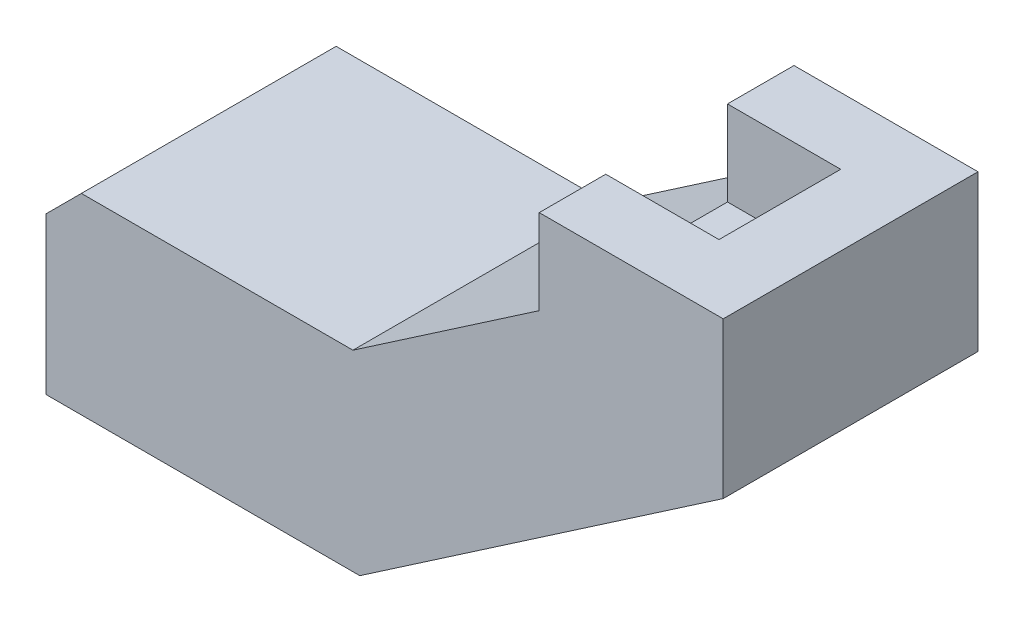
ISO-10303-21;
HEADER;
FILE_DESCRIPTION(('STEP AP214'),'2;1');
FILE_NAME('part.step','',(''),(''),'','','');
FILE_SCHEMA(('AUTOMOTIVE_DESIGN { 1 0 10303 214 1 1 1 1 }'));
ENDSEC;
DATA;
#1=APPLICATION_CONTEXT('core data for automotive mechanical design processes');
#2=APPLICATION_PROTOCOL_DEFINITION('international standard','automotive_design',2000,#1);
#3=PRODUCT_CONTEXT('',#1,'mechanical');
#4=PRODUCT('Part','Part','',(#3));
#5=PRODUCT_RELATED_PRODUCT_CATEGORY('part','',(#4));
#6=PRODUCT_DEFINITION_FORMATION('','',#4);
#7=PRODUCT_DEFINITION_CONTEXT('part definition',#1,'design');
#8=PRODUCT_DEFINITION('design','',#6,#7);
#9=PRODUCT_DEFINITION_SHAPE('','',#8);
#10=(LENGTH_UNIT() NAMED_UNIT(*) SI_UNIT(.MILLI.,.METRE.));
#11=(NAMED_UNIT(*) PLANE_ANGLE_UNIT() SI_UNIT($,.RADIAN.));
#12=(NAMED_UNIT(*) SI_UNIT($,.STERADIAN.) SOLID_ANGLE_UNIT());
#13=UNCERTAINTY_MEASURE_WITH_UNIT(LENGTH_MEASURE(1.E-05),#10,'distance_accuracy_value','');
#14=(GEOMETRIC_REPRESENTATION_CONTEXT(3) GLOBAL_UNCERTAINTY_ASSIGNED_CONTEXT((#13)) GLOBAL_UNIT_ASSIGNED_CONTEXT((#10,
#11,#12)) REPRESENTATION_CONTEXT('',''));
#15=CARTESIAN_POINT('',(0.,0.,0.));
#16=DIRECTION('',(0.,0.,1.));
#17=DIRECTION('',(1.,0.,0.));
#18=AXIS2_PLACEMENT_3D('',#15,#16,#17);
#19=CARTESIAN_POINT('',(-20.6795033401632,-22.556349186104,5.));
#20=DIRECTION('',(0.,1.,0.));
#21=DIRECTION('',(0.,0.,1.));
#22=AXIS2_PLACEMENT_3D('',#19,#20,#21);
#23=PLANE('',#22);
#24=DIRECTION('',(0.,0.,1.));
#25=VECTOR('',#24,1.);
#26=CARTESIAN_POINT('',(-42.85,-22.556349186104,-13.));
#27=LINE('',#26,#25);
#28=CARTESIAN_POINT('',(-42.85,-22.556349186104,-13.));
#29=VERTEX_POINT('',#28);
#30=CARTESIAN_POINT('',(-42.85,-22.556349186104,5.));
#31=VERTEX_POINT('',#30);
#32=EDGE_CURVE('E173',#29,#31,#27,.T.);
#33=ORIENTED_EDGE('',*,*,#32,.F.);
#34=DIRECTION('',(1.,0.,0.));
#35=VECTOR('',#34,1.);
#36=CARTESIAN_POINT('',(-20.6795033401632,-22.556349186104,-13.));
#37=LINE('',#36,#35);
#38=CARTESIAN_POINT('',(-20.6795033401632,-22.556349186104,-13.));
#39=VERTEX_POINT('',#38);
#40=EDGE_CURVE('E182',#29,#39,#37,.T.);
#41=ORIENTED_EDGE('',*,*,#40,.T.);
#42=DIRECTION('',(0.,0.,-1.));
#43=VECTOR('',#42,1.);
#44=CARTESIAN_POINT('',(-20.6795033401632,-22.556349186104,5.));
#45=LINE('',#44,#43);
#46=CARTESIAN_POINT('',(-20.6795033401632,-22.556349186104,5.));
#47=VERTEX_POINT('',#46);
#48=EDGE_CURVE('E222',#47,#39,#45,.T.);
#49=ORIENTED_EDGE('',*,*,#48,.F.);
#50=DIRECTION('',(1.,0.,0.));
#51=VECTOR('',#50,1.);
#52=CARTESIAN_POINT('',(-20.6795033401632,-22.556349186104,5.));
#53=LINE('',#52,#51);
#54=EDGE_CURVE('E184',#31,#47,#53,.T.);
#55=ORIENTED_EDGE('',*,*,#54,.F.);
#56=EDGE_LOOP('',(#33,#41,#49,#55));
#57=FACE_BOUND('',#56,.T.);
#58=ADVANCED_FACE('F42',(#57),#23,.F.);
#59=CARTESIAN_POINT('',(0.,0.,5.));
#60=DIRECTION('',(0.,0.,-1.));
#61=DIRECTION('',(-1.,0.,0.));
#62=AXIS2_PLACEMENT_3D('',#59,#60,#61);
#63=PLANE('',#62);
#64=DIRECTION('',(-1.,0.,0.));
#65=VECTOR('',#64,1.);
#66=CARTESIAN_POINT('',(-34.3284271247462,-8.99999999999999,5.));
#67=LINE('',#66,#65);
#68=CARTESIAN_POINT('',(-21.1642135623731,-8.99999999999999,5.));
#69=VERTEX_POINT('',#68);
#70=CARTESIAN_POINT('',(-40.35,-8.99999999999999,5.));
#71=VERTEX_POINT('',#70);
#72=EDGE_CURVE('E207',#69,#71,#67,.T.);
#73=ORIENTED_EDGE('',*,*,#72,.T.);
#74=DIRECTION('',(-0.707106781186547,-0.707106781186549,0.));
#75=VECTOR('',#74,1.);
#76=CARTESIAN_POINT('',(-40.35,-8.99999999999999,5.));
#77=LINE('',#76,#75);
#78=CARTESIAN_POINT('',(-42.85,-11.5,5.));
#79=VERTEX_POINT('',#78);
#80=EDGE_CURVE('E65',#71,#79,#77,.T.);
#81=ORIENTED_EDGE('',*,*,#80,.T.);
#82=DIRECTION('',(0.,-1.,0.));
#83=VECTOR('',#82,1.);
#84=CARTESIAN_POINT('',(-42.85,0.,5.));
#85=LINE('',#84,#83);
#86=EDGE_CURVE('E178',#79,#31,#85,.T.);
#87=ORIENTED_EDGE('',*,*,#86,.T.);
#88=ORIENTED_EDGE('',*,*,#54,.T.);
#89=DIRECTION('',(0.82551451114158,0.56438089256696,0.));
#90=VECTOR('',#89,1.);
#91=CARTESIAN_POINT('',(5.,-5.,5.));
#92=LINE('',#91,#90);
#93=CARTESIAN_POINT('',(5.,-5.,5.));
#94=VERTEX_POINT('',#93);
#95=EDGE_CURVE('E210',#47,#94,#92,.T.);
#96=ORIENTED_EDGE('',*,*,#95,.T.);
#97=DIRECTION('',(0.,1.,0.));
#98=VECTOR('',#97,1.);
#99=CARTESIAN_POINT('',(5.,6.,5.));
#100=LINE('',#99,#98);
#101=CARTESIAN_POINT('',(5.,6.,5.));
#102=VERTEX_POINT('',#101);
#103=EDGE_CURVE('E212',#94,#102,#100,.T.);
#104=ORIENTED_EDGE('',*,*,#103,.T.);
#105=DIRECTION('',(-1.,0.,0.));
#106=VECTOR('',#105,1.);
#107=CARTESIAN_POINT('',(0.,6.,5.));
#108=LINE('',#107,#106);
#109=CARTESIAN_POINT('',(-8.,6.,5.));
#110=VERTEX_POINT('',#109);
#111=EDGE_CURVE('E214',#102,#110,#108,.T.);
#112=ORIENTED_EDGE('',*,*,#111,.T.);
#113=DIRECTION('',(0.,-1.,0.));
#114=VECTOR('',#113,1.);
#115=CARTESIAN_POINT('',(-8.,15.2784697014109,5.));
#116=LINE('',#115,#114);
#117=CARTESIAN_POINT('',(-8.,0.,5.));
#118=VERTEX_POINT('',#117);
#119=EDGE_CURVE('E273',#110,#118,#116,.T.);
#120=ORIENTED_EDGE('',*,*,#119,.T.);
#121=DIRECTION('',(-0.82551451114158,-0.56438089256696,0.));
#122=VECTOR('',#121,1.);
#123=CARTESIAN_POINT('',(-8.,0.,5.));
#124=LINE('',#123,#122);
#125=EDGE_CURVE('E205',#118,#69,#124,.T.);
#126=ORIENTED_EDGE('',*,*,#125,.T.);
#127=EDGE_LOOP('',(#73,#81,#87,#88,#96,#104,#112,#120,#126));
#128=FACE_BOUND('',#127,.T.);
#129=ADVANCED_FACE('F269',(#128),#63,.F.);
#130=CARTESIAN_POINT('',(0.,0.,-13.));
#131=DIRECTION('',(0.,0.,-1.));
#132=DIRECTION('',(-1.,0.,0.));
#133=AXIS2_PLACEMENT_3D('',#130,#131,#132);
#134=PLANE('',#133);
#135=DIRECTION('',(0.,-1.,0.));
#136=VECTOR('',#135,1.);
#137=CARTESIAN_POINT('',(-42.85,0.,-13.));
#138=LINE('',#137,#136);
#139=CARTESIAN_POINT('',(-42.85,-11.5,-13.));
#140=VERTEX_POINT('',#139);
#141=EDGE_CURVE('E170',#140,#29,#138,.T.);
#142=ORIENTED_EDGE('',*,*,#141,.F.);
#143=DIRECTION('',(0.707106781186547,0.707106781186549,0.));
#144=VECTOR('',#143,1.);
#145=CARTESIAN_POINT('',(-15.6750000000001,15.675,-13.));
#146=LINE('',#145,#144);
#147=CARTESIAN_POINT('',(-40.35,-8.99999999999999,-13.));
#148=VERTEX_POINT('',#147);
#149=EDGE_CURVE('E11',#140,#148,#146,.T.);
#150=ORIENTED_EDGE('',*,*,#149,.T.);
#151=DIRECTION('',(-1.,0.,0.));
#152=VECTOR('',#151,1.);
#153=CARTESIAN_POINT('',(-34.3284271247462,-8.99999999999999,-13.));
#154=LINE('',#153,#152);
#155=CARTESIAN_POINT('',(-21.1642135623731,-8.99999999999999,-13.));
#156=VERTEX_POINT('',#155);
#157=EDGE_CURVE('E192',#156,#148,#154,.T.);
#158=ORIENTED_EDGE('',*,*,#157,.F.);
#159=DIRECTION('',(-0.82551451114158,-0.56438089256696,0.));
#160=VECTOR('',#159,1.);
#161=CARTESIAN_POINT('',(-8.,0.,-13.));
#162=LINE('',#161,#160);
#163=CARTESIAN_POINT('',(-8.,0.,-13.));
#164=VERTEX_POINT('',#163);
#165=EDGE_CURVE('E197',#164,#156,#162,.T.);
#166=ORIENTED_EDGE('',*,*,#165,.F.);
#167=DIRECTION('',(0.,-1.,0.));
#168=VECTOR('',#167,1.);
#169=CARTESIAN_POINT('',(-8.,15.2784697014109,-13.));
#170=LINE('',#169,#168);
#171=CARTESIAN_POINT('',(-8.,6.,-13.));
#172=VERTEX_POINT('',#171);
#173=EDGE_CURVE('E325',#172,#164,#170,.T.);
#174=ORIENTED_EDGE('',*,*,#173,.F.);
#175=DIRECTION('',(-1.,0.,0.));
#176=VECTOR('',#175,1.);
#177=CARTESIAN_POINT('',(0.,6.,-13.));
#178=LINE('',#177,#176);
#179=CARTESIAN_POINT('',(5.,6.,-13.));
#180=VERTEX_POINT('',#179);
#181=EDGE_CURVE('E203',#180,#172,#178,.T.);
#182=ORIENTED_EDGE('',*,*,#181,.F.);
#183=DIRECTION('',(0.,1.,0.));
#184=VECTOR('',#183,1.);
#185=CARTESIAN_POINT('',(5.,6.,-13.));
#186=LINE('',#185,#184);
#187=CARTESIAN_POINT('',(5.,-5.,-13.));
#188=VERTEX_POINT('',#187);
#189=EDGE_CURVE('E194',#188,#180,#186,.T.);
#190=ORIENTED_EDGE('',*,*,#189,.F.);
#191=DIRECTION('',(0.82551451114158,0.56438089256696,0.));
#192=VECTOR('',#191,1.);
#193=CARTESIAN_POINT('',(5.,-5.,-13.));
#194=LINE('',#193,#192);
#195=EDGE_CURVE('E191',#39,#188,#194,.T.);
#196=ORIENTED_EDGE('',*,*,#195,.F.);
#197=ORIENTED_EDGE('',*,*,#40,.F.);
#198=EDGE_LOOP('',(#142,#150,#158,#166,#174,#182,#190,#196,#197));
#199=FACE_BOUND('',#198,.T.);
#200=ADVANCED_FACE('F188',(#199),#134,.T.);
#201=CARTESIAN_POINT('',(-3.,-22.556349186104,-3.95));
#202=DIRECTION('',(0.,1.,0.));
#203=DIRECTION('',(0.,0.,1.));
#204=AXIS2_PLACEMENT_3D('',#201,#202,#203);
#205=CYLINDRICAL_SURFACE('',#204,1.5);
#206=CARTESIAN_POINT('',(-3.,0.,-3.95));
#207=DIRECTION('',(0.,1.,0.));
#208=DIRECTION('',(0.,0.,1.));
#209=AXIS2_PLACEMENT_3D('',#206,#207,#208);
#210=CIRCLE('',#209,1.5);
#211=CARTESIAN_POINT('',(-3.,0.,-2.45));
#212=VERTEX_POINT('',#211);
#213=EDGE_CURVE('E348',#212,#212,#210,.T.);
#214=ORIENTED_EDGE('',*,*,#213,.T.);
#215=EDGE_LOOP('',(#214));
#216=FACE_BOUND('',#215,.T.);
#217=CARTESIAN_POINT('',(-3.,-5.,-3.95));
#218=DIRECTION('',(0.,-1.,0.));
#219=DIRECTION('',(0.,0.,-1.));
#220=AXIS2_PLACEMENT_3D('',#217,#218,#219);
#221=CIRCLE('',#220,1.5);
#222=CARTESIAN_POINT('',(-3.,-5.,-5.45));
#223=VERTEX_POINT('',#222);
#224=EDGE_CURVE('E234',#223,#223,#221,.F.);
#225=ORIENTED_EDGE('',*,*,#224,.F.);
#226=EDGE_LOOP('',(#225));
#227=FACE_BOUND('',#226,.T.);
#228=ADVANCED_FACE('F308',(#216,#227),#205,.F.);
#229=CARTESIAN_POINT('',(0.,0.,5.));
#230=DIRECTION('',(1.,0.,0.));
#231=DIRECTION('',(0.,0.,-1.));
#232=AXIS2_PLACEMENT_3D('',#229,#230,#231);
#233=PLANE('',#232);
#234=DIRECTION('',(0.,-1.,0.));
#235=VECTOR('',#234,1.);
#236=CARTESIAN_POINT('',(0.,15.2784697014109,-8.3));
#237=LINE('',#236,#235);
#238=CARTESIAN_POINT('',(0.,6.,-8.3));
#239=VERTEX_POINT('',#238);
#240=CARTESIAN_POINT('',(0.,0.,-8.3));
#241=VERTEX_POINT('',#240);
#242=EDGE_CURVE('E317',#239,#241,#237,.T.);
#243=ORIENTED_EDGE('',*,*,#242,.T.);
#244=DIRECTION('',(0.,0.,-1.));
#245=VECTOR('',#244,1.);
#246=CARTESIAN_POINT('',(0.,0.,5.));
#247=LINE('',#246,#245);
#248=CARTESIAN_POINT('',(0.,0.,0.3));
#249=VERTEX_POINT('',#248);
#250=EDGE_CURVE('E230',#249,#241,#247,.T.);
#251=ORIENTED_EDGE('',*,*,#250,.F.);
#252=DIRECTION('',(0.,-1.,0.));
#253=VECTOR('',#252,1.);
#254=CARTESIAN_POINT('',(0.,15.2784697014109,0.3));
#255=LINE('',#254,#253);
#256=CARTESIAN_POINT('',(0.,6.,0.3));
#257=VERTEX_POINT('',#256);
#258=EDGE_CURVE('E354',#257,#249,#255,.T.);
#259=ORIENTED_EDGE('',*,*,#258,.F.);
#260=DIRECTION('',(0.,0.,-1.));
#261=VECTOR('',#260,1.);
#262=CARTESIAN_POINT('',(0.,6.,5.));
#263=LINE('',#262,#261);
#264=EDGE_CURVE('E216',#257,#239,#263,.T.);
#265=ORIENTED_EDGE('',*,*,#264,.T.);
#266=EDGE_LOOP('',(#243,#251,#259,#265));
#267=FACE_BOUND('',#266,.T.);
#268=ADVANCED_FACE('F305',(#267),#233,.F.);
#269=CARTESIAN_POINT('',(-8.,0.,5.));
#270=DIRECTION('',(0.,-1.,0.));
#271=DIRECTION('',(0.,0.,-1.));
#272=AXIS2_PLACEMENT_3D('',#269,#270,#271);
#273=PLANE('',#272);
#274=ORIENTED_EDGE('',*,*,#213,.F.);
#275=EDGE_LOOP('',(#274));
#276=FACE_BOUND('',#275,.T.);
#277=DIRECTION('',(1.,0.,0.));
#278=VECTOR('',#277,1.);
#279=CARTESIAN_POINT('',(-8.,0.,-8.3));
#280=LINE('',#279,#278);
#281=CARTESIAN_POINT('',(-8.,0.,-8.3));
#282=VERTEX_POINT('',#281);
#283=EDGE_CURVE('E330',#282,#241,#280,.T.);
#284=ORIENTED_EDGE('',*,*,#283,.F.);
#285=DIRECTION('',(0.,0.,-1.));
#286=VECTOR('',#285,1.);
#287=CARTESIAN_POINT('',(-8.,0.,5.));
#288=LINE('',#287,#286);
#289=CARTESIAN_POINT('',(-8.,0.,0.3));
#290=VERTEX_POINT('',#289);
#291=EDGE_CURVE('E226',#290,#282,#288,.T.);
#292=ORIENTED_EDGE('',*,*,#291,.F.);
#293=DIRECTION('',(-1.,0.,0.));
#294=VECTOR('',#293,1.);
#295=CARTESIAN_POINT('',(-8.,0.,0.3));
#296=LINE('',#295,#294);
#297=EDGE_CURVE('E333',#249,#290,#296,.T.);
#298=ORIENTED_EDGE('',*,*,#297,.F.);
#299=ORIENTED_EDGE('',*,*,#250,.T.);
#300=EDGE_LOOP('',(#284,#292,#298,#299));
#301=FACE_BOUND('',#300,.T.);
#302=ADVANCED_FACE('F303',(#276,#301),#273,.F.);
#303=CARTESIAN_POINT('',(-8.,0.,5.));
#304=DIRECTION('',(0.56438089256696,-0.82551451114158,0.));
#305=DIRECTION('',(0.82551451114158,0.56438089256696,0.));
#306=AXIS2_PLACEMENT_3D('',#303,#304,#305);
#307=PLANE('',#306);
#308=EDGE_CURVE('E227',#118,#290,#288,.T.);
#309=ORIENTED_EDGE('',*,*,#308,.T.);
#310=ORIENTED_EDGE('',*,*,#291,.T.);
#311=DIRECTION('',(0.,0.,1.));
#312=VECTOR('',#311,1.);
#313=CARTESIAN_POINT('',(-8.,0.,-13.));
#314=LINE('',#313,#312);
#315=EDGE_CURVE('E237',#164,#282,#314,.T.);
#316=ORIENTED_EDGE('',*,*,#315,.F.);
#317=ORIENTED_EDGE('',*,*,#165,.T.);
#318=DIRECTION('',(0.,0.,-1.));
#319=VECTOR('',#318,1.);
#320=CARTESIAN_POINT('',(-21.1642135623731,-8.99999999999999,5.));
#321=LINE('',#320,#319);
#322=EDGE_CURVE('E224',#69,#156,#321,.T.);
#323=ORIENTED_EDGE('',*,*,#322,.F.);
#324=ORIENTED_EDGE('',*,*,#125,.F.);
#325=EDGE_LOOP('',(#309,#310,#316,#317,#323,#324));
#326=FACE_BOUND('',#325,.T.);
#327=ADVANCED_FACE('F277',(#326),#307,.F.);
#328=CARTESIAN_POINT('',(-34.3284271247462,-8.99999999999999,5.));
#329=DIRECTION('',(0.,-1.,0.));
#330=DIRECTION('',(0.,0.,-1.));
#331=AXIS2_PLACEMENT_3D('',#328,#329,#330);
#332=PLANE('',#331);
#333=ORIENTED_EDGE('',*,*,#157,.T.);
#334=DIRECTION('',(0.,0.,1.));
#335=VECTOR('',#334,1.);
#336=CARTESIAN_POINT('',(-40.35,-8.99999999999999,5.));
#337=LINE('',#336,#335);
#338=EDGE_CURVE('E256',#148,#71,#337,.T.);
#339=ORIENTED_EDGE('',*,*,#338,.T.);
#340=ORIENTED_EDGE('',*,*,#72,.F.);
#341=ORIENTED_EDGE('',*,*,#322,.T.);
#342=EDGE_LOOP('',(#333,#339,#340,#341));
#343=FACE_BOUND('',#342,.T.);
#344=ADVANCED_FACE('F266',(#343),#332,.F.);
#345=CARTESIAN_POINT('',(5.,-5.,5.));
#346=DIRECTION('',(-0.56438089256696,0.825514511141579,0.));
#347=DIRECTION('',(-0.82551451114158,-0.56438089256696,0.));
#348=AXIS2_PLACEMENT_3D('',#345,#346,#347);
#349=PLANE('',#348);
#350=DIRECTION('',(0.82551451114158,0.56438089256696,0.));
#351=VECTOR('',#350,1.);
#352=CARTESIAN_POINT('',(5.,-5.,-0.95));
#353=LINE('',#352,#351);
#354=CARTESIAN_POINT('',(-4.73205080756888,-11.6535275239283,-0.949999999999999));
#355=VERTEX_POINT('',#354);
#356=CARTESIAN_POINT('',(-1.26794919243112,-9.28521935356014,-0.95));
#357=VERTEX_POINT('',#356);
#358=EDGE_CURVE('E250',#355,#357,#353,.T.);
#359=ORIENTED_EDGE('',*,*,#358,.T.);
#360=DIRECTION('',(0.473121017820373,0.323459441022298,-0.819469640993586));
#361=VECTOR('',#360,1.);
#362=CARTESIAN_POINT('',(-1.51598345640961,-9.45479335547294,-0.520392052771308));
#363=LINE('',#362,#361);
#364=CARTESIAN_POINT('',(0.464101615137756,-8.10106526837605,-3.95));
#365=VERTEX_POINT('',#364);
#366=EDGE_CURVE('E253',#357,#365,#363,.T.);
#367=ORIENTED_EDGE('',*,*,#366,.T.);
#368=DIRECTION('',(-0.473121017820373,-0.323459441022298,-0.819469640993586));
#369=VECTOR('',#368,1.);
#370=CARTESIAN_POINT('',(5.42399530368447,-4.71012641848448,4.64078786870312));
#371=LINE('',#370,#369);
#372=CARTESIAN_POINT('',(-1.26794919243112,-9.28521935356014,-6.95));
#373=VERTEX_POINT('',#372);
#374=EDGE_CURVE('E233',#365,#373,#371,.T.);
#375=ORIENTED_EDGE('',*,*,#374,.T.);
#376=DIRECTION('',(-0.82551451114158,-0.56438089256696,0.));
#377=VECTOR('',#376,1.);
#378=CARTESIAN_POINT('',(5.,-5.,-6.95));
#379=LINE('',#378,#377);
#380=CARTESIAN_POINT('',(-4.73205080756888,-11.6535275239283,-6.95));
#381=VERTEX_POINT('',#380);
#382=EDGE_CURVE('E241',#373,#381,#379,.T.);
#383=ORIENTED_EDGE('',*,*,#382,.T.);
#384=DIRECTION('',(-0.473121017820373,-0.323459441022298,0.819469640993586));
#385=VECTOR('',#384,1.);
#386=CARTESIAN_POINT('',(-6.16848318384698,-12.6355756595993,-4.46202614264943));
#387=LINE('',#386,#385);
#388=CARTESIAN_POINT('',(-6.46410161513776,-12.8376816091124,-3.95));
#389=VERTEX_POINT('',#388);
#390=EDGE_CURVE('E244',#381,#389,#387,.T.);
#391=ORIENTED_EDGE('',*,*,#390,.T.);
#392=DIRECTION('',(0.473121017820373,0.323459441022298,0.819469640993586));
#393=VECTOR('',#392,1.);
#394=CARTESIAN_POINT('',(0.7714955762471,-7.89090872261082,8.58242195858124));
#395=LINE('',#394,#393);
#396=EDGE_CURVE('E247',#389,#355,#395,.T.);
#397=ORIENTED_EDGE('',*,*,#396,.T.);
#398=EDGE_LOOP('',(#359,#367,#375,#383,#391,#397));
#399=FACE_BOUND('',#398,.T.);
#400=ORIENTED_EDGE('',*,*,#48,.T.);
#401=ORIENTED_EDGE('',*,*,#195,.T.);
#402=DIRECTION('',(0.,0.,-1.));
#403=VECTOR('',#402,1.);
#404=CARTESIAN_POINT('',(5.,-5.,5.));
#405=LINE('',#404,#403);
#406=EDGE_CURVE('E220',#94,#188,#405,.T.);
#407=ORIENTED_EDGE('',*,*,#406,.F.);
#408=ORIENTED_EDGE('',*,*,#95,.F.);
#409=EDGE_LOOP('',(#400,#401,#407,#408));
#410=FACE_BOUND('',#409,.T.);
#411=ADVANCED_FACE('F297',(#399,#410),#349,.F.);
#412=CARTESIAN_POINT('',(5.,6.,5.));
#413=DIRECTION('',(-1.,0.,0.));
#414=DIRECTION('',(0.,-1.,0.));
#415=AXIS2_PLACEMENT_3D('',#412,#413,#414);
#416=PLANE('',#415);
#417=ORIENTED_EDGE('',*,*,#406,.T.);
#418=ORIENTED_EDGE('',*,*,#189,.T.);
#419=DIRECTION('',(0.,0.,-1.));
#420=VECTOR('',#419,1.);
#421=CARTESIAN_POINT('',(5.,6.,5.));
#422=LINE('',#421,#420);
#423=EDGE_CURVE('E218',#102,#180,#422,.T.);
#424=ORIENTED_EDGE('',*,*,#423,.F.);
#425=ORIENTED_EDGE('',*,*,#103,.F.);
#426=EDGE_LOOP('',(#417,#418,#424,#425));
#427=FACE_BOUND('',#426,.T.);
#428=ADVANCED_FACE('F418',(#427),#416,.F.);
#429=CARTESIAN_POINT('',(0.,6.,5.));
#430=DIRECTION('',(0.,-1.,0.));
#431=DIRECTION('',(0.,0.,-1.));
#432=AXIS2_PLACEMENT_3D('',#429,#430,#431);
#433=PLANE('',#432);
#434=ORIENTED_EDGE('',*,*,#423,.T.);
#435=ORIENTED_EDGE('',*,*,#181,.T.);
#436=DIRECTION('',(0.,0.,-1.));
#437=VECTOR('',#436,1.);
#438=CARTESIAN_POINT('',(-8.,6.,-13.));
#439=LINE('',#438,#437);
#440=CARTESIAN_POINT('',(-8.,6.,-8.3));
#441=VERTEX_POINT('',#440);
#442=EDGE_CURVE('E352',#441,#172,#439,.T.);
#443=ORIENTED_EDGE('',*,*,#442,.F.);
#444=DIRECTION('',(-1.,0.,0.));
#445=VECTOR('',#444,1.);
#446=CARTESIAN_POINT('',(-8.,6.,-8.3));
#447=LINE('',#446,#445);
#448=EDGE_CURVE('E344',#239,#441,#447,.T.);
#449=ORIENTED_EDGE('',*,*,#448,.F.);
#450=ORIENTED_EDGE('',*,*,#264,.F.);
#451=DIRECTION('',(1.,0.,0.));
#452=VECTOR('',#451,1.);
#453=CARTESIAN_POINT('',(-8.,6.,0.3));
#454=LINE('',#453,#452);
#455=CARTESIAN_POINT('',(-8.,6.,0.3));
#456=VERTEX_POINT('',#455);
#457=EDGE_CURVE('E349',#456,#257,#454,.T.);
#458=ORIENTED_EDGE('',*,*,#457,.F.);
#459=DIRECTION('',(0.,0.,-1.));
#460=VECTOR('',#459,1.);
#461=CARTESIAN_POINT('',(-8.,6.,5.));
#462=LINE('',#461,#460);
#463=EDGE_CURVE('E345',#110,#456,#462,.T.);
#464=ORIENTED_EDGE('',*,*,#463,.F.);
#465=ORIENTED_EDGE('',*,*,#111,.F.);
#466=EDGE_LOOP('',(#434,#435,#443,#449,#450,#458,#464,#465));
#467=FACE_BOUND('',#466,.T.);
#468=ADVANCED_FACE('F410',(#467),#433,.F.);
#469=CARTESIAN_POINT('',(-8.,15.2784697014109,0.3));
#470=DIRECTION('',(0.,0.,1.));
#471=DIRECTION('',(1.,0.,0.));
#472=AXIS2_PLACEMENT_3D('',#469,#470,#471);
#473=PLANE('',#472);
#474=DIRECTION('',(0.,-1.,0.));
#475=VECTOR('',#474,1.);
#476=CARTESIAN_POINT('',(-8.,15.2784697014109,0.3));
#477=LINE('',#476,#475);
#478=EDGE_CURVE('E351',#456,#290,#477,.T.);
#479=ORIENTED_EDGE('',*,*,#478,.F.);
#480=ORIENTED_EDGE('',*,*,#457,.T.);
#481=ORIENTED_EDGE('',*,*,#258,.T.);
#482=ORIENTED_EDGE('',*,*,#297,.T.);
#483=EDGE_LOOP('',(#479,#480,#481,#482));
#484=FACE_BOUND('',#483,.T.);
#485=ADVANCED_FACE('F407',(#484),#473,.F.);
#486=CARTESIAN_POINT('',(-8.,15.2784697014109,5.));
#487=DIRECTION('',(1.,0.,0.));
#488=DIRECTION('',(0.,0.,-1.));
#489=AXIS2_PLACEMENT_3D('',#486,#487,#488);
#490=PLANE('',#489);
#491=ORIENTED_EDGE('',*,*,#119,.F.);
#492=ORIENTED_EDGE('',*,*,#463,.T.);
#493=ORIENTED_EDGE('',*,*,#478,.T.);
#494=ORIENTED_EDGE('',*,*,#308,.F.);
#495=EDGE_LOOP('',(#491,#492,#493,#494));
#496=FACE_BOUND('',#495,.T.);
#497=ADVANCED_FACE('F403',(#496),#490,.F.);
#498=CARTESIAN_POINT('',(-8.,15.2784697014109,-8.3));
#499=DIRECTION('',(0.,0.,-1.));
#500=DIRECTION('',(-1.,0.,0.));
#501=AXIS2_PLACEMENT_3D('',#498,#499,#500);
#502=PLANE('',#501);
#503=ORIENTED_EDGE('',*,*,#242,.F.);
#504=ORIENTED_EDGE('',*,*,#448,.T.);
#505=DIRECTION('',(0.,-1.,0.));
#506=VECTOR('',#505,1.);
#507=CARTESIAN_POINT('',(-8.,15.2784697014109,-8.3));
#508=LINE('',#507,#506);
#509=EDGE_CURVE('E324',#441,#282,#508,.T.);
#510=ORIENTED_EDGE('',*,*,#509,.T.);
#511=ORIENTED_EDGE('',*,*,#283,.T.);
#512=EDGE_LOOP('',(#503,#504,#510,#511));
#513=FACE_BOUND('',#512,.T.);
#514=ADVANCED_FACE('F335',(#513),#502,.F.);
#515=CARTESIAN_POINT('',(-8.,15.2784697014109,-13.));
#516=DIRECTION('',(1.,0.,0.));
#517=DIRECTION('',(0.,0.,-1.));
#518=AXIS2_PLACEMENT_3D('',#515,#516,#517);
#519=PLANE('',#518);
#520=ORIENTED_EDGE('',*,*,#509,.F.);
#521=ORIENTED_EDGE('',*,*,#442,.T.);
#522=ORIENTED_EDGE('',*,*,#173,.T.);
#523=ORIENTED_EDGE('',*,*,#315,.T.);
#524=EDGE_LOOP('',(#520,#521,#522,#523));
#525=FACE_BOUND('',#524,.T.);
#526=ADVANCED_FACE('F399',(#525),#519,.F.);
#527=CARTESIAN_POINT('',(0.464101615137755,-22.556349186104,-3.95));
#528=DIRECTION('',(0.866025403784439,0.,0.5));
#529=DIRECTION('',(0.5,0.,-0.866025403784439));
#530=AXIS2_PLACEMENT_3D('',#527,#528,#529);
#531=PLANE('',#530);
#532=DIRECTION('',(0.,1.,0.));
#533=VECTOR('',#532,1.);
#534=CARTESIAN_POINT('',(-1.26794919243112,-22.556349186104,-0.95));
#535=LINE('',#534,#533);
#536=CARTESIAN_POINT('',(-1.26794919243112,-5.,-0.95));
#537=VERTEX_POINT('',#536);
#538=EDGE_CURVE('E238',#357,#537,#535,.T.);
#539=ORIENTED_EDGE('',*,*,#538,.T.);
#540=DIRECTION('',(0.5,0.,-0.866025403784439));
#541=VECTOR('',#540,1.);
#542=CARTESIAN_POINT('',(0.464101615137755,-5.,-3.95));
#543=LINE('',#542,#541);
#544=CARTESIAN_POINT('',(0.464101615137755,-5.,-3.95));
#545=VERTEX_POINT('',#544);
#546=EDGE_CURVE('E185',#537,#545,#543,.T.);
#547=ORIENTED_EDGE('',*,*,#546,.T.);
#548=DIRECTION('',(0.,1.,0.));
#549=VECTOR('',#548,1.);
#550=CARTESIAN_POINT('',(0.464101615137755,-22.556349186104,-3.95));
#551=LINE('',#550,#549);
#552=EDGE_CURVE('E452',#365,#545,#551,.T.);
#553=ORIENTED_EDGE('',*,*,#552,.F.);
#554=ORIENTED_EDGE('',*,*,#366,.F.);
#555=EDGE_LOOP('',(#539,#547,#553,#554));
#556=FACE_BOUND('',#555,.T.);
#557=ADVANCED_FACE('F385',(#556),#531,.F.);
#558=CARTESIAN_POINT('',(-1.26794919243112,-22.556349186104,-0.95));
#559=DIRECTION('',(0.,0.,1.));
#560=DIRECTION('',(1.,0.,0.));
#561=AXIS2_PLACEMENT_3D('',#558,#559,#560);
#562=PLANE('',#561);
#563=DIRECTION('',(0.,1.,0.));
#564=VECTOR('',#563,1.);
#565=CARTESIAN_POINT('',(-4.73205080756888,-22.556349186104,-0.95));
#566=LINE('',#565,#564);
#567=CARTESIAN_POINT('',(-4.73205080756888,-5.,-0.95));
#568=VERTEX_POINT('',#567);
#569=EDGE_CURVE('E454',#355,#568,#566,.T.);
#570=ORIENTED_EDGE('',*,*,#569,.T.);
#571=DIRECTION('',(1.,0.,0.));
#572=VECTOR('',#571,1.);
#573=CARTESIAN_POINT('',(-1.26794919243112,-5.,-0.95));
#574=LINE('',#573,#572);
#575=EDGE_CURVE('E449',#568,#537,#574,.T.);
#576=ORIENTED_EDGE('',*,*,#575,.T.);
#577=ORIENTED_EDGE('',*,*,#538,.F.);
#578=ORIENTED_EDGE('',*,*,#358,.F.);
#579=EDGE_LOOP('',(#570,#576,#577,#578));
#580=FACE_BOUND('',#579,.T.);
#581=ADVANCED_FACE('F381',(#580),#562,.F.);
#582=CARTESIAN_POINT('',(-4.73205080756888,-22.556349186104,-0.95));
#583=DIRECTION('',(-0.866025403784438,0.,0.5));
#584=DIRECTION('',(0.5,0.,0.866025403784439));
#585=AXIS2_PLACEMENT_3D('',#582,#583,#584);
#586=PLANE('',#585);
#587=DIRECTION('',(0.,1.,0.));
#588=VECTOR('',#587,1.);
#589=CARTESIAN_POINT('',(-6.46410161513776,-22.556349186104,-3.95));
#590=LINE('',#589,#588);
#591=CARTESIAN_POINT('',(-6.46410161513776,-5.,-3.95));
#592=VERTEX_POINT('',#591);
#593=EDGE_CURVE('E456',#389,#592,#590,.T.);
#594=ORIENTED_EDGE('',*,*,#593,.T.);
#595=DIRECTION('',(0.5,0.,0.866025403784438));
#596=VECTOR('',#595,1.);
#597=CARTESIAN_POINT('',(-4.73205080756888,-5.,-0.95));
#598=LINE('',#597,#596);
#599=EDGE_CURVE('E446',#592,#568,#598,.T.);
#600=ORIENTED_EDGE('',*,*,#599,.T.);
#601=ORIENTED_EDGE('',*,*,#569,.F.);
#602=ORIENTED_EDGE('',*,*,#396,.F.);
#603=EDGE_LOOP('',(#594,#600,#601,#602));
#604=FACE_BOUND('',#603,.T.);
#605=ADVANCED_FACE('F384',(#604),#586,.F.);
#606=CARTESIAN_POINT('',(-6.46410161513776,-22.556349186104,-3.95));
#607=DIRECTION('',(-0.866025403784438,0.,-0.5));
#608=DIRECTION('',(-0.5,0.,0.866025403784439));
#609=AXIS2_PLACEMENT_3D('',#606,#607,#608);
#610=PLANE('',#609);
#611=DIRECTION('',(0.,1.,0.));
#612=VECTOR('',#611,1.);
#613=CARTESIAN_POINT('',(-4.73205080756888,-22.556349186104,-6.95));
#614=LINE('',#613,#612);
#615=CARTESIAN_POINT('',(-4.73205080756888,-5.,-6.95));
#616=VERTEX_POINT('',#615);
#617=EDGE_CURVE('E458',#381,#616,#614,.T.);
#618=ORIENTED_EDGE('',*,*,#617,.T.);
#619=DIRECTION('',(-0.5,0.,0.866025403784438));
#620=VECTOR('',#619,1.);
#621=CARTESIAN_POINT('',(-6.46410161513776,-5.,-3.95));
#622=LINE('',#621,#620);
#623=EDGE_CURVE('E443',#616,#592,#622,.T.);
#624=ORIENTED_EDGE('',*,*,#623,.T.);
#625=ORIENTED_EDGE('',*,*,#593,.F.);
#626=ORIENTED_EDGE('',*,*,#390,.F.);
#627=EDGE_LOOP('',(#618,#624,#625,#626));
#628=FACE_BOUND('',#627,.T.);
#629=ADVANCED_FACE('F389',(#628),#610,.F.);
#630=CARTESIAN_POINT('',(-4.73205080756888,-22.556349186104,-6.95));
#631=DIRECTION('',(0.,0.,-1.));
#632=DIRECTION('',(-1.,0.,0.));
#633=AXIS2_PLACEMENT_3D('',#630,#631,#632);
#634=PLANE('',#633);
#635=DIRECTION('',(0.,1.,0.));
#636=VECTOR('',#635,1.);
#637=CARTESIAN_POINT('',(-1.26794919243112,-22.556349186104,-6.95));
#638=LINE('',#637,#636);
#639=CARTESIAN_POINT('',(-1.26794919243112,-5.,-6.95));
#640=VERTEX_POINT('',#639);
#641=EDGE_CURVE('E460',#373,#640,#638,.T.);
#642=ORIENTED_EDGE('',*,*,#641,.T.);
#643=DIRECTION('',(-1.,0.,0.));
#644=VECTOR('',#643,1.);
#645=CARTESIAN_POINT('',(-4.73205080756888,-5.,-6.95));
#646=LINE('',#645,#644);
#647=EDGE_CURVE('E440',#640,#616,#646,.T.);
#648=ORIENTED_EDGE('',*,*,#647,.T.);
#649=ORIENTED_EDGE('',*,*,#617,.F.);
#650=ORIENTED_EDGE('',*,*,#382,.F.);
#651=EDGE_LOOP('',(#642,#648,#649,#650));
#652=FACE_BOUND('',#651,.T.);
#653=ADVANCED_FACE('F375',(#652),#634,.F.);
#654=CARTESIAN_POINT('',(-1.26794919243112,-22.556349186104,-6.95));
#655=DIRECTION('',(0.866025403784439,0.,-0.5));
#656=DIRECTION('',(-0.5,0.,-0.866025403784439));
#657=AXIS2_PLACEMENT_3D('',#654,#655,#656);
#658=PLANE('',#657);
#659=ORIENTED_EDGE('',*,*,#552,.T.);
#660=DIRECTION('',(-0.5,0.,-0.866025403784439));
#661=VECTOR('',#660,1.);
#662=CARTESIAN_POINT('',(-1.26794919243112,-5.,-6.95));
#663=LINE('',#662,#661);
#664=EDGE_CURVE('E437',#545,#640,#663,.T.);
#665=ORIENTED_EDGE('',*,*,#664,.T.);
#666=ORIENTED_EDGE('',*,*,#641,.F.);
#667=ORIENTED_EDGE('',*,*,#374,.F.);
#668=EDGE_LOOP('',(#659,#665,#666,#667));
#669=FACE_BOUND('',#668,.T.);
#670=ADVANCED_FACE('F365',(#669),#658,.F.);
#671=CARTESIAN_POINT('',(0.,-5.,0.));
#672=DIRECTION('',(0.,-1.,0.));
#673=DIRECTION('',(0.,0.,-1.));
#674=AXIS2_PLACEMENT_3D('',#671,#672,#673);
#675=PLANE('',#674);
#676=ORIENTED_EDGE('',*,*,#546,.F.);
#677=ORIENTED_EDGE('',*,*,#575,.F.);
#678=ORIENTED_EDGE('',*,*,#599,.F.);
#679=ORIENTED_EDGE('',*,*,#623,.F.);
#680=ORIENTED_EDGE('',*,*,#647,.F.);
#681=ORIENTED_EDGE('',*,*,#664,.F.);
#682=EDGE_LOOP('',(#676,#677,#678,#679,#680,#681));
#683=FACE_BOUND('',#682,.T.);
#684=ORIENTED_EDGE('',*,*,#224,.T.);
#685=EDGE_LOOP('',(#684));
#686=FACE_BOUND('',#685,.T.);
#687=ADVANCED_FACE('F363',(#683,#686),#675,.T.);
#688=CARTESIAN_POINT('',(-42.85,0.,-13.));
#689=DIRECTION('',(-1.,0.,0.));
#690=DIRECTION('',(0.,0.,1.));
#691=AXIS2_PLACEMENT_3D('',#688,#689,#690);
#692=PLANE('',#691);
#693=CARTESIAN_POINT('',(-42.85,-15.1,-3.95));
#694=DIRECTION('',(-1.,0.,0.));
#695=DIRECTION('',(0.,0.,1.));
#696=AXIS2_PLACEMENT_3D('',#693,#694,#695);
#697=CIRCLE('',#696,3.10000000000001);
#698=CARTESIAN_POINT('',(-42.85,-15.1,-0.849999999999989));
#699=VERTEX_POINT('',#698);
#700=EDGE_CURVE('E257',#699,#699,#697,.T.);
#701=ORIENTED_EDGE('',*,*,#700,.F.);
#702=EDGE_LOOP('',(#701));
#703=FACE_BOUND('',#702,.T.);
#704=ORIENTED_EDGE('',*,*,#86,.F.);
#705=DIRECTION('',(0.,0.,-1.));
#706=VECTOR('',#705,1.);
#707=CARTESIAN_POINT('',(-42.85,-11.5,-13.));
#708=LINE('',#707,#706);
#709=EDGE_CURVE('E51',#79,#140,#708,.T.);
#710=ORIENTED_EDGE('',*,*,#709,.T.);
#711=ORIENTED_EDGE('',*,*,#141,.T.);
#712=ORIENTED_EDGE('',*,*,#32,.T.);
#713=EDGE_LOOP('',(#704,#710,#711,#712));
#714=FACE_BOUND('',#713,.T.);
#715=ADVANCED_FACE('F172',(#703,#714),#692,.T.);
#716=CARTESIAN_POINT('',(-24.85,0.,-3.95));
#717=DIRECTION('',(1.,0.,0.));
#718=DIRECTION('',(0.,1.,0.));
#719=AXIS2_PLACEMENT_3D('',#716,#717,#718);
#720=PLANE('',#719);
#721=CARTESIAN_POINT('',(-24.85,-15.1,-3.95));
#722=DIRECTION('',(-1.,0.,0.));
#723=DIRECTION('',(0.,-1.,0.));
#724=AXIS2_PLACEMENT_3D('',#721,#722,#723);
#725=CIRCLE('',#724,2.24999999999999);
#726=CARTESIAN_POINT('',(-24.85,-17.35,-3.95));
#727=VERTEX_POINT('',#726);
#728=EDGE_CURVE('E260',#727,#727,#725,.T.);
#729=ORIENTED_EDGE('',*,*,#728,.T.);
#730=EDGE_LOOP('',(#729));
#731=FACE_BOUND('',#730,.T.);
#732=ADVANCED_FACE('F372',(#731),#720,.F.);
#733=CARTESIAN_POINT('',(-25.85,-15.1,-3.95));
#734=DIRECTION('',(-1.,0.,0.));
#735=DIRECTION('',(0.,-1.,0.));
#736=AXIS2_PLACEMENT_3D('',#733,#734,#735);
#737=CONICAL_SURFACE('',#736,2.75,0.463647609000809);
#738=ORIENTED_EDGE('',*,*,#728,.F.);
#739=EDGE_LOOP('',(#738));
#740=FACE_BOUND('',#739,.T.);
#741=CARTESIAN_POINT('',(-25.85,-15.1,-3.95));
#742=DIRECTION('',(-1.,0.,0.));
#743=DIRECTION('',(0.,-1.,0.));
#744=AXIS2_PLACEMENT_3D('',#741,#742,#743);
#745=CIRCLE('',#744,2.75);
#746=CARTESIAN_POINT('',(-25.85,-17.85,-3.95));
#747=VERTEX_POINT('',#746);
#748=EDGE_CURVE('E480',#747,#747,#745,.T.);
#749=ORIENTED_EDGE('',*,*,#748,.T.);
#750=EDGE_LOOP('',(#749));
#751=FACE_BOUND('',#750,.T.);
#752=ADVANCED_FACE('F498',(#740,#751),#737,.F.);
#753=CARTESIAN_POINT('',(-45.9970076728184,-15.1,-3.95));
#754=DIRECTION('',(-1.,0.,0.));
#755=DIRECTION('',(0.,-1.,0.));
#756=AXIS2_PLACEMENT_3D('',#753,#754,#755);
#757=CYLINDRICAL_SURFACE('',#756,2.75);
#758=ORIENTED_EDGE('',*,*,#748,.F.);
#759=EDGE_LOOP('',(#758));
#760=FACE_BOUND('',#759,.T.);
#761=CARTESIAN_POINT('',(-38.2902643223103,-15.1,-3.95));
#762=DIRECTION('',(-1.,0.,0.));
#763=DIRECTION('',(0.,-1.,0.));
#764=AXIS2_PLACEMENT_3D('',#761,#762,#763);
#765=CIRCLE('',#764,2.75000000000001);
#766=CARTESIAN_POINT('',(-38.2902643223103,-17.85,-3.95));
#767=VERTEX_POINT('',#766);
#768=EDGE_CURVE('E483',#767,#767,#765,.T.);
#769=ORIENTED_EDGE('',*,*,#768,.T.);
#770=EDGE_LOOP('',(#769));
#771=FACE_BOUND('',#770,.T.);
#772=ADVANCED_FACE('F492',(#760,#771),#757,.F.);
#773=CARTESIAN_POINT('',(-39.7902643223103,-15.1,-3.95));
#774=DIRECTION('',(-1.,0.,0.));
#775=DIRECTION('',(0.,-1.,0.));
#776=AXIS2_PLACEMENT_3D('',#773,#774,#775);
#777=CONICAL_SURFACE('',#776,3.10000000000001,0.229231933276996);
#778=ORIENTED_EDGE('',*,*,#768,.F.);
#779=EDGE_LOOP('',(#778));
#780=FACE_BOUND('',#779,.T.);
#781=CARTESIAN_POINT('',(-39.7902643223103,-15.1,-3.95));
#782=DIRECTION('',(-1.,0.,0.));
#783=DIRECTION('',(0.,-1.,0.));
#784=AXIS2_PLACEMENT_3D('',#781,#782,#783);
#785=CIRCLE('',#784,3.10000000000001);
#786=CARTESIAN_POINT('',(-39.7902643223103,-18.2,-3.95));
#787=VERTEX_POINT('',#786);
#788=EDGE_CURVE('E486',#787,#787,#785,.T.);
#789=ORIENTED_EDGE('',*,*,#788,.T.);
#790=EDGE_LOOP('',(#789));
#791=FACE_BOUND('',#790,.T.);
#792=ADVANCED_FACE('F286',(#780,#791),#777,.F.);
#793=CARTESIAN_POINT('',(-45.9970076728184,-15.1,-3.95));
#794=DIRECTION('',(-1.,0.,0.));
#795=DIRECTION('',(0.,-1.,0.));
#796=AXIS2_PLACEMENT_3D('',#793,#794,#795);
#797=CYLINDRICAL_SURFACE('',#796,3.10000000000001);
#798=ORIENTED_EDGE('',*,*,#700,.T.);
#799=EDGE_LOOP('',(#798));
#800=FACE_BOUND('',#799,.T.);
#801=ORIENTED_EDGE('',*,*,#788,.F.);
#802=EDGE_LOOP('',(#801));
#803=FACE_BOUND('',#802,.T.);
#804=ADVANCED_FACE('F282',(#800,#803),#797,.F.);
#805=CARTESIAN_POINT('',(-40.35,-8.99999999999999,5.));
#806=DIRECTION('',(-0.707106781186548,0.707106781186546,0.));
#807=DIRECTION('',(0.,0.,-1.));
#808=AXIS2_PLACEMENT_3D('',#805,#806,#807);
#809=PLANE('',#808);
#810=ORIENTED_EDGE('',*,*,#149,.F.);
#811=ORIENTED_EDGE('',*,*,#709,.F.);
#812=ORIENTED_EDGE('',*,*,#80,.F.);
#813=ORIENTED_EDGE('',*,*,#338,.F.);
#814=EDGE_LOOP('',(#810,#811,#812,#813));
#815=FACE_BOUND('',#814,.T.);
#816=ADVANCED_FACE('F45',(#815),#809,.T.);
#817=CLOSED_SHELL('',(#58,#129,#200,#228,#268,#302,#327,#344,#411,#428,#468,#485,#497,#514,#526,
#557,#581,#605,#629,#653,#670,#687,#715,#732,#752,#772,#792,#804,#816));
#818=MANIFOLD_SOLID_BREP('B2',#817);
#819=ADVANCED_BREP_SHAPE_REPRESENTATION('',(#18,#818),#14);
#820=SHAPE_DEFINITION_REPRESENTATION(#9,#819);
ENDSEC;
END-ISO-10303-21;
